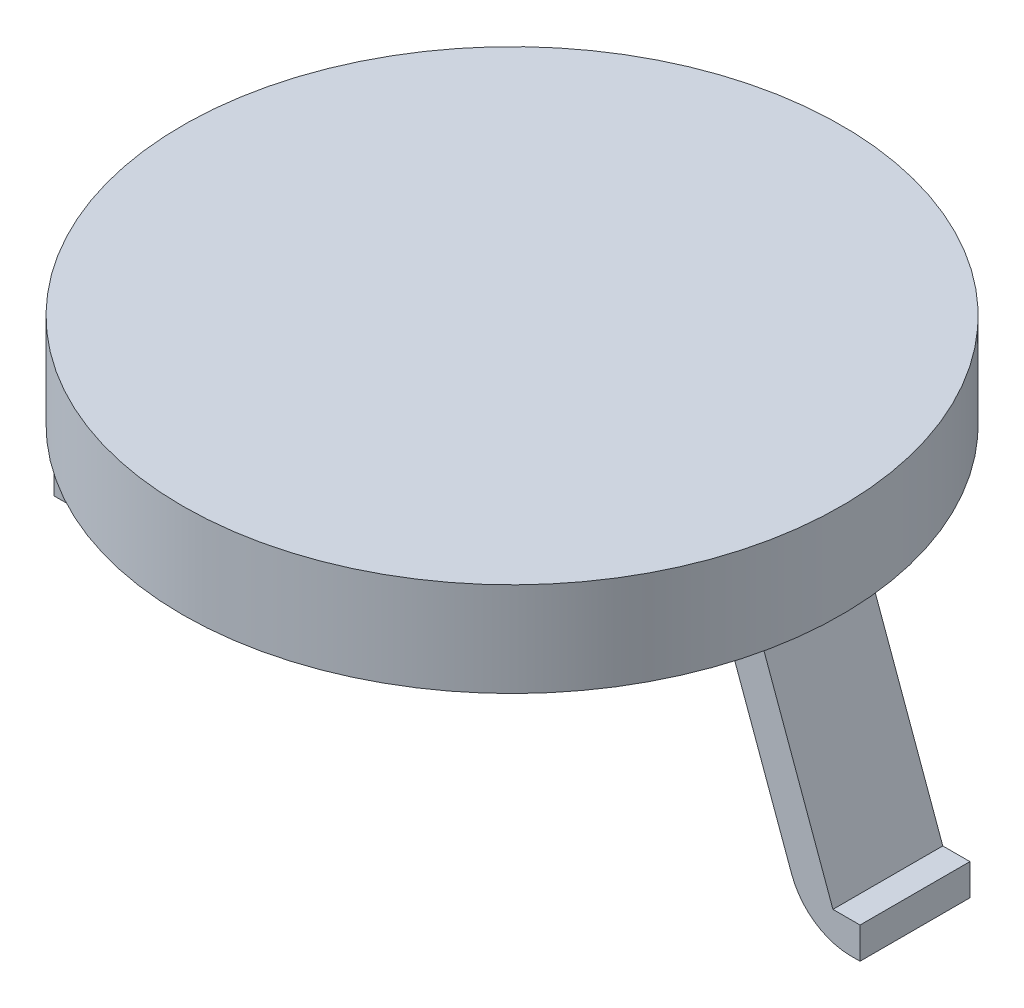
ISO-10303-21;
HEADER;
FILE_DESCRIPTION(('STEP AP214'),'2;1');
FILE_NAME('part.step','',(''),(''),'','','');
FILE_SCHEMA(('AUTOMOTIVE_DESIGN { 1 0 10303 214 1 1 1 1 }'));
ENDSEC;
DATA;
#1=APPLICATION_CONTEXT('core data for automotive mechanical design processes');
#2=APPLICATION_PROTOCOL_DEFINITION('international standard','automotive_design',2000,#1);
#3=PRODUCT_CONTEXT('',#1,'mechanical');
#4=PRODUCT('Part','Part','',(#3));
#5=PRODUCT_RELATED_PRODUCT_CATEGORY('part','',(#4));
#6=PRODUCT_DEFINITION_FORMATION('','',#4);
#7=PRODUCT_DEFINITION_CONTEXT('part definition',#1,'design');
#8=PRODUCT_DEFINITION('design','',#6,#7);
#9=PRODUCT_DEFINITION_SHAPE('','',#8);
#10=(LENGTH_UNIT() NAMED_UNIT(*) SI_UNIT(.MILLI.,.METRE.));
#11=(NAMED_UNIT(*) PLANE_ANGLE_UNIT() SI_UNIT($,.RADIAN.));
#12=(NAMED_UNIT(*) SI_UNIT($,.STERADIAN.) SOLID_ANGLE_UNIT());
#13=UNCERTAINTY_MEASURE_WITH_UNIT(LENGTH_MEASURE(1.E-05),#10,'distance_accuracy_value','');
#14=(GEOMETRIC_REPRESENTATION_CONTEXT(3) GLOBAL_UNCERTAINTY_ASSIGNED_CONTEXT((#13)) GLOBAL_UNIT_ASSIGNED_CONTEXT((#10,
#11,#12)) REPRESENTATION_CONTEXT('',''));
#15=CARTESIAN_POINT('',(0.,0.,0.));
#16=DIRECTION('',(0.,0.,1.));
#17=DIRECTION('',(1.,0.,0.));
#18=AXIS2_PLACEMENT_3D('',#15,#16,#17);
#19=CARTESIAN_POINT('',(0.,3.,0.));
#20=DIRECTION('',(0.,-1.,0.));
#21=DIRECTION('',(0.,0.,-1.));
#22=AXIS2_PLACEMENT_3D('',#19,#20,#21);
#23=CYLINDRICAL_SURFACE('',#22,10.5);
#24=CARTESIAN_POINT('',(0.,3.,0.));
#25=DIRECTION('',(0.,1.,0.));
#26=DIRECTION('',(0.,0.,1.));
#27=AXIS2_PLACEMENT_3D('',#24,#25,#26);
#28=CIRCLE('',#27,10.5);
#29=CARTESIAN_POINT('',(0.,3.,10.5));
#30=VERTEX_POINT('',#29);
#31=EDGE_CURVE('E269',#30,#30,#28,.T.);
#32=ORIENTED_EDGE('',*,*,#31,.F.);
#33=EDGE_LOOP('',(#32));
#34=FACE_BOUND('',#33,.T.);
#35=CARTESIAN_POINT('',(0.,0.,0.));
#36=DIRECTION('',(0.,1.,0.));
#37=DIRECTION('',(0.,0.,1.));
#38=AXIS2_PLACEMENT_3D('',#35,#36,#37);
#39=CIRCLE('',#38,10.5);
#40=CARTESIAN_POINT('',(0.,0.,10.5));
#41=VERTEX_POINT('',#40);
#42=EDGE_CURVE('E266',#41,#41,#39,.T.);
#43=ORIENTED_EDGE('',*,*,#42,.T.);
#44=EDGE_LOOP('',(#43));
#45=FACE_BOUND('',#44,.T.);
#46=ADVANCED_FACE('F39',(#34,#45),#23,.T.);
#47=CARTESIAN_POINT('',(0.,3.,0.));
#48=DIRECTION('',(0.,1.,0.));
#49=DIRECTION('',(0.,0.,1.));
#50=AXIS2_PLACEMENT_3D('',#47,#48,#49);
#51=PLANE('',#50);
#52=ORIENTED_EDGE('',*,*,#31,.T.);
#53=EDGE_LOOP('',(#52));
#54=FACE_BOUND('',#53,.T.);
#55=ADVANCED_FACE('F335',(#54),#51,.T.);
#56=CARTESIAN_POINT('',(0.,0.,0.));
#57=DIRECTION('',(0.,1.,0.));
#58=DIRECTION('',(0.,0.,1.));
#59=AXIS2_PLACEMENT_3D('',#56,#57,#58);
#60=PLANE('',#59);
#61=DIRECTION('',(0.,0.,1.));
#62=VECTOR('',#61,1.);
#63=CARTESIAN_POINT('',(8.4,0.,-1.75));
#64=LINE('',#63,#62);
#65=CARTESIAN_POINT('',(8.4,0.,1.75));
#66=VERTEX_POINT('',#65);
#67=CARTESIAN_POINT('',(8.4,0.,-1.75));
#68=VERTEX_POINT('',#67);
#69=EDGE_CURVE('E205',#66,#68,#64,.F.);
#70=ORIENTED_EDGE('',*,*,#69,.F.);
#71=DIRECTION('',(-1.,0.,0.));
#72=VECTOR('',#71,1.);
#73=CARTESIAN_POINT('',(9.6,0.,1.75));
#74=LINE('',#73,#72);
#75=CARTESIAN_POINT('',(9.6,0.,1.75));
#76=VERTEX_POINT('',#75);
#77=EDGE_CURVE('E199',#76,#66,#74,.T.);
#78=ORIENTED_EDGE('',*,*,#77,.F.);
#79=DIRECTION('',(0.,0.,1.));
#80=VECTOR('',#79,1.);
#81=CARTESIAN_POINT('',(9.6,0.,-1.75));
#82=LINE('',#81,#80);
#83=CARTESIAN_POINT('',(9.6,0.,-1.75));
#84=VERTEX_POINT('',#83);
#85=EDGE_CURVE('E218',#84,#76,#82,.T.);
#86=ORIENTED_EDGE('',*,*,#85,.F.);
#87=DIRECTION('',(-1.,0.,0.));
#88=VECTOR('',#87,1.);
#89=CARTESIAN_POINT('',(9.6,0.,-1.75));
#90=LINE('',#89,#88);
#91=EDGE_CURVE('E221',#68,#84,#90,.F.);
#92=ORIENTED_EDGE('',*,*,#91,.F.);
#93=EDGE_LOOP('',(#70,#78,#86,#92));
#94=FACE_BOUND('',#93,.T.);
#95=DIRECTION('',(0.,0.,1.));
#96=VECTOR('',#95,1.);
#97=CARTESIAN_POINT('',(-8.4,0.,-1.75));
#98=LINE('',#97,#96);
#99=CARTESIAN_POINT('',(-8.4,0.,-1.75));
#100=VERTEX_POINT('',#99);
#101=CARTESIAN_POINT('',(-8.4,0.,1.75));
#102=VERTEX_POINT('',#101);
#103=EDGE_CURVE('E239',#100,#102,#98,.T.);
#104=ORIENTED_EDGE('',*,*,#103,.F.);
#105=DIRECTION('',(1.,0.,0.));
#106=VECTOR('',#105,1.);
#107=CARTESIAN_POINT('',(-9.6,0.,-1.75));
#108=LINE('',#107,#106);
#109=CARTESIAN_POINT('',(-9.6,0.,-1.75));
#110=VERTEX_POINT('',#109);
#111=EDGE_CURVE('E234',#110,#100,#108,.T.);
#112=ORIENTED_EDGE('',*,*,#111,.F.);
#113=DIRECTION('',(0.,0.,1.));
#114=VECTOR('',#113,1.);
#115=CARTESIAN_POINT('',(-9.6,0.,-1.75));
#116=LINE('',#115,#114);
#117=CARTESIAN_POINT('',(-9.6,0.,1.75));
#118=VERTEX_POINT('',#117);
#119=EDGE_CURVE('E249',#118,#110,#116,.F.);
#120=ORIENTED_EDGE('',*,*,#119,.F.);
#121=DIRECTION('',(1.,0.,0.));
#122=VECTOR('',#121,1.);
#123=CARTESIAN_POINT('',(-9.6,0.,1.75));
#124=LINE('',#123,#122);
#125=EDGE_CURVE('E252',#102,#118,#124,.F.);
#126=ORIENTED_EDGE('',*,*,#125,.F.);
#127=EDGE_LOOP('',(#104,#112,#120,#126));
#128=FACE_BOUND('',#127,.T.);
#129=ORIENTED_EDGE('',*,*,#42,.F.);
#130=EDGE_LOOP('',(#129));
#131=FACE_BOUND('',#130,.T.);
#132=ADVANCED_FACE('F325',(#94,#128,#131),#60,.F.);
#133=CARTESIAN_POINT('',(-2.73616114660536,-7.51754096628726,0.));
#134=DIRECTION('',(0.,-1.,0.));
#135=DIRECTION('',(0.,0.,-1.));
#136=AXIS2_PLACEMENT_3D('',#133,#134,#135);
#137=PLANE('',#136);
#138=DIRECTION('',(1.,0.,0.));
#139=VECTOR('',#138,1.);
#140=CARTESIAN_POINT('',(-12.3361611466054,-7.51754096628726,-1.75));
#141=LINE('',#140,#139);
#142=CARTESIAN_POINT('',(-12.8361611466054,-7.51754096628726,-1.75));
#143=VERTEX_POINT('',#142);
#144=CARTESIAN_POINT('',(-12.5365762230248,-7.51754096628726,-1.75));
#145=VERTEX_POINT('',#144);
#146=EDGE_CURVE('E160',#143,#145,#141,.T.);
#147=ORIENTED_EDGE('',*,*,#146,.T.);
#148=DIRECTION('',(0.,0.,1.));
#149=VECTOR('',#148,1.);
#150=CARTESIAN_POINT('',(-12.5365762230248,-7.51754096628726,0.));
#151=LINE('',#150,#149);
#152=CARTESIAN_POINT('',(-12.5365762230248,-7.51754096628726,1.75));
#153=VERTEX_POINT('',#152);
#154=EDGE_CURVE('E281',#145,#153,#151,.T.);
#155=ORIENTED_EDGE('',*,*,#154,.T.);
#156=DIRECTION('',(1.,0.,0.));
#157=VECTOR('',#156,1.);
#158=CARTESIAN_POINT('',(-12.3361611466054,-7.51754096628726,1.75));
#159=LINE('',#158,#157);
#160=CARTESIAN_POINT('',(-12.8361611466054,-7.51754096628726,1.75));
#161=VERTEX_POINT('',#160);
#162=EDGE_CURVE('E256',#153,#161,#159,.F.);
#163=ORIENTED_EDGE('',*,*,#162,.T.);
#164=DIRECTION('',(0.,0.,1.));
#165=VECTOR('',#164,1.);
#166=CARTESIAN_POINT('',(-12.8361611466054,-7.51754096628726,-1.75));
#167=LINE('',#166,#165);
#168=EDGE_CURVE('E170',#143,#161,#167,.T.);
#169=ORIENTED_EDGE('',*,*,#168,.F.);
#170=EDGE_LOOP('',(#147,#155,#163,#169));
#171=FACE_BOUND('',#170,.T.);
#172=ADVANCED_FACE('F347',(#171),#137,.T.);
#173=CARTESIAN_POINT('',(-9.6,0.,-1.75));
#174=DIRECTION('',(0.,0.,-1.));
#175=DIRECTION('',(-1.,0.,0.));
#176=AXIS2_PLACEMENT_3D('',#173,#174,#175);
#177=PLANE('',#176);
#178=DIRECTION('',(-0.342020143325669,-0.939692620785908,0.));
#179=VECTOR('',#178,1.);
#180=CARTESIAN_POINT('',(-8.4,0.,-1.75));
#181=LINE('',#180,#179);
#182=CARTESIAN_POINT('',(-10.657190981453,-6.2015812529386,-1.75));
#183=VERTEX_POINT('',#182);
#184=EDGE_CURVE('E242',#100,#183,#181,.T.);
#185=ORIENTED_EDGE('',*,*,#184,.T.);
#186=CARTESIAN_POINT('',(-12.5365762230248,-5.51754096628726,-1.75));
#187=DIRECTION('',(0.,0.,-1.));
#188=DIRECTION('',(-1.,0.,0.));
#189=AXIS2_PLACEMENT_3D('',#186,#187,#188);
#190=CIRCLE('',#189,2.);
#191=EDGE_CURVE('E291',#183,#145,#190,.T.);
#192=ORIENTED_EDGE('',*,*,#191,.T.);
#193=ORIENTED_EDGE('',*,*,#146,.F.);
#194=DIRECTION('',(0.,-1.,0.));
#195=VECTOR('',#194,1.);
#196=CARTESIAN_POINT('',(-12.8361611466054,-6.51754096628726,-1.75));
#197=LINE('',#196,#195);
#198=CARTESIAN_POINT('',(-12.8361611466054,-6.51754096628726,-1.75));
#199=VERTEX_POINT('',#198);
#200=EDGE_CURVE('E156',#199,#143,#197,.T.);
#201=ORIENTED_EDGE('',*,*,#200,.F.);
#202=DIRECTION('',(-1.,0.,0.));
#203=VECTOR('',#202,1.);
#204=CARTESIAN_POINT('',(-11.8361611466054,-6.51754096628726,-1.75));
#205=LINE('',#204,#203);
#206=CARTESIAN_POINT('',(-11.9721909123392,-6.51754096628726,-1.75));
#207=VERTEX_POINT('',#206);
#208=EDGE_CURVE('E141',#207,#199,#205,.T.);
#209=ORIENTED_EDGE('',*,*,#208,.F.);
#210=DIRECTION('',(-0.342020143325669,-0.939692620785908,0.));
#211=VECTOR('',#210,1.);
#212=CARTESIAN_POINT('',(-9.6,0.,-1.75));
#213=LINE('',#212,#211);
#214=EDGE_CURVE('E243',#110,#207,#213,.T.);
#215=ORIENTED_EDGE('',*,*,#214,.F.);
#216=ORIENTED_EDGE('',*,*,#111,.T.);
#217=EDGE_LOOP('',(#185,#192,#193,#201,#209,#215,#216));
#218=FACE_BOUND('',#217,.T.);
#219=ADVANCED_FACE('F158',(#218),#177,.T.);
#220=CARTESIAN_POINT('',(-8.4,0.,-1.75));
#221=DIRECTION('',(0.939692620785908,-0.342020143325669,0.));
#222=DIRECTION('',(0.342020143325669,0.939692620785908,0.));
#223=AXIS2_PLACEMENT_3D('',#220,#221,#222);
#224=PLANE('',#223);
#225=DIRECTION('',(-0.342020143325669,-0.939692620785908,0.));
#226=VECTOR('',#225,1.);
#227=CARTESIAN_POINT('',(-8.4,0.,1.75));
#228=LINE('',#227,#226);
#229=CARTESIAN_POINT('',(-10.657190981453,-6.2015812529386,1.75));
#230=VERTEX_POINT('',#229);
#231=EDGE_CURVE('E246',#102,#230,#228,.T.);
#232=ORIENTED_EDGE('',*,*,#231,.T.);
#233=DIRECTION('',(0.,0.,1.));
#234=VECTOR('',#233,1.);
#235=CARTESIAN_POINT('',(-10.657190981453,-6.2015812529386,-1.75));
#236=LINE('',#235,#234);
#237=EDGE_CURVE('E288',#230,#183,#236,.F.);
#238=ORIENTED_EDGE('',*,*,#237,.T.);
#239=ORIENTED_EDGE('',*,*,#184,.F.);
#240=ORIENTED_EDGE('',*,*,#103,.T.);
#241=EDGE_LOOP('',(#232,#238,#239,#240));
#242=FACE_BOUND('',#241,.T.);
#243=ADVANCED_FACE('F359',(#242),#224,.T.);
#244=CARTESIAN_POINT('',(-9.6,0.,1.75));
#245=DIRECTION('',(0.,0.,1.));
#246=DIRECTION('',(1.,0.,0.));
#247=AXIS2_PLACEMENT_3D('',#244,#245,#246);
#248=PLANE('',#247);
#249=ORIENTED_EDGE('',*,*,#162,.F.);
#250=CARTESIAN_POINT('',(-12.5365762230248,-5.51754096628726,1.75));
#251=DIRECTION('',(0.,0.,1.));
#252=DIRECTION('',(1.,0.,0.));
#253=AXIS2_PLACEMENT_3D('',#250,#251,#252);
#254=CIRCLE('',#253,2.);
#255=EDGE_CURVE('E285',#153,#230,#254,.T.);
#256=ORIENTED_EDGE('',*,*,#255,.T.);
#257=ORIENTED_EDGE('',*,*,#231,.F.);
#258=ORIENTED_EDGE('',*,*,#125,.T.);
#259=DIRECTION('',(-0.342020143325669,-0.939692620785908,0.));
#260=VECTOR('',#259,1.);
#261=CARTESIAN_POINT('',(-9.6,0.,1.75));
#262=LINE('',#261,#260);
#263=CARTESIAN_POINT('',(-11.9721909123392,-6.51754096628726,1.75));
#264=VERTEX_POINT('',#263);
#265=EDGE_CURVE('E262',#118,#264,#262,.T.);
#266=ORIENTED_EDGE('',*,*,#265,.T.);
#267=DIRECTION('',(1.,0.,0.));
#268=VECTOR('',#267,1.);
#269=CARTESIAN_POINT('',(-11.8361611466054,-6.51754096628726,1.75));
#270=LINE('',#269,#268);
#271=CARTESIAN_POINT('',(-12.8361611466054,-6.51754096628726,1.75));
#272=VERTEX_POINT('',#271);
#273=EDGE_CURVE('E153',#272,#264,#270,.T.);
#274=ORIENTED_EDGE('',*,*,#273,.F.);
#275=DIRECTION('',(0.,-1.,0.));
#276=VECTOR('',#275,1.);
#277=CARTESIAN_POINT('',(-12.8361611466054,-6.51754096628726,1.75));
#278=LINE('',#277,#276);
#279=EDGE_CURVE('E165',#272,#161,#278,.T.);
#280=ORIENTED_EDGE('',*,*,#279,.T.);
#281=EDGE_LOOP('',(#249,#256,#257,#258,#266,#274,#280));
#282=FACE_BOUND('',#281,.T.);
#283=ADVANCED_FACE('F355',(#282),#248,.T.);
#284=CARTESIAN_POINT('',(-9.6,0.,-1.75));
#285=DIRECTION('',(-0.939692620785908,0.342020143325669,0.));
#286=DIRECTION('',(-0.342020143325669,-0.939692620785908,0.));
#287=AXIS2_PLACEMENT_3D('',#284,#285,#286);
#288=PLANE('',#287);
#289=DIRECTION('',(0.,0.,-1.));
#290=VECTOR('',#289,1.);
#291=CARTESIAN_POINT('',(-11.9721909123392,-6.51754096628726,-1.75));
#292=LINE('',#291,#290);
#293=EDGE_CURVE('E148',#264,#207,#292,.T.);
#294=ORIENTED_EDGE('',*,*,#293,.F.);
#295=ORIENTED_EDGE('',*,*,#265,.F.);
#296=ORIENTED_EDGE('',*,*,#119,.T.);
#297=ORIENTED_EDGE('',*,*,#214,.T.);
#298=EDGE_LOOP('',(#294,#295,#296,#297));
#299=FACE_BOUND('',#298,.T.);
#300=ADVANCED_FACE('F348',(#299),#288,.T.);
#301=CARTESIAN_POINT('',(2.73616114660536,-7.51754096628726,0.));
#302=DIRECTION('',(0.,-1.,0.));
#303=DIRECTION('',(0.,0.,-1.));
#304=AXIS2_PLACEMENT_3D('',#301,#302,#303);
#305=PLANE('',#304);
#306=DIRECTION('',(-1.,0.,0.));
#307=VECTOR('',#306,1.);
#308=CARTESIAN_POINT('',(12.3361611466054,-7.51754096628726,1.75));
#309=LINE('',#308,#307);
#310=CARTESIAN_POINT('',(12.8361611466054,-7.51754096628726,1.75));
#311=VERTEX_POINT('',#310);
#312=CARTESIAN_POINT('',(12.5365762230248,-7.51754096628726,1.75));
#313=VERTEX_POINT('',#312);
#314=EDGE_CURVE('E206',#311,#313,#309,.T.);
#315=ORIENTED_EDGE('',*,*,#314,.T.);
#316=DIRECTION('',(0.,0.,-1.));
#317=VECTOR('',#316,1.);
#318=CARTESIAN_POINT('',(12.5365762230248,-7.51754096628726,0.));
#319=LINE('',#318,#317);
#320=CARTESIAN_POINT('',(12.5365762230248,-7.51754096628726,-1.75));
#321=VERTEX_POINT('',#320);
#322=EDGE_CURVE('E294',#313,#321,#319,.T.);
#323=ORIENTED_EDGE('',*,*,#322,.T.);
#324=DIRECTION('',(-1.,0.,0.));
#325=VECTOR('',#324,1.);
#326=CARTESIAN_POINT('',(12.3361611466054,-7.51754096628726,-1.75));
#327=LINE('',#326,#325);
#328=CARTESIAN_POINT('',(12.8361611466054,-7.51754096628726,-1.75));
#329=VERTEX_POINT('',#328);
#330=EDGE_CURVE('E224',#321,#329,#327,.F.);
#331=ORIENTED_EDGE('',*,*,#330,.T.);
#332=DIRECTION('',(0.,0.,1.));
#333=VECTOR('',#332,1.);
#334=CARTESIAN_POINT('',(12.8361611466054,-7.51754096628726,-1.75));
#335=LINE('',#334,#333);
#336=EDGE_CURVE('E178',#329,#311,#335,.T.);
#337=ORIENTED_EDGE('',*,*,#336,.T.);
#338=EDGE_LOOP('',(#315,#323,#331,#337));
#339=FACE_BOUND('',#338,.T.);
#340=ADVANCED_FACE('F302',(#339),#305,.T.);
#341=CARTESIAN_POINT('',(9.6,0.,1.75));
#342=DIRECTION('',(0.,0.,1.));
#343=DIRECTION('',(1.,0.,0.));
#344=AXIS2_PLACEMENT_3D('',#341,#342,#343);
#345=PLANE('',#344);
#346=DIRECTION('',(0.342020143325669,-0.939692620785908,0.));
#347=VECTOR('',#346,1.);
#348=CARTESIAN_POINT('',(8.4,0.,1.75));
#349=LINE('',#348,#347);
#350=CARTESIAN_POINT('',(10.657190981453,-6.2015812529386,1.75));
#351=VERTEX_POINT('',#350);
#352=EDGE_CURVE('E210',#66,#351,#349,.T.);
#353=ORIENTED_EDGE('',*,*,#352,.T.);
#354=CARTESIAN_POINT('',(12.5365762230248,-5.51754096628726,1.75));
#355=DIRECTION('',(0.,0.,1.));
#356=DIRECTION('',(1.,0.,0.));
#357=AXIS2_PLACEMENT_3D('',#354,#355,#356);
#358=CIRCLE('',#357,2.);
#359=EDGE_CURVE('E11',#351,#313,#358,.T.);
#360=ORIENTED_EDGE('',*,*,#359,.T.);
#361=ORIENTED_EDGE('',*,*,#314,.F.);
#362=DIRECTION('',(0.,-1.,0.));
#363=VECTOR('',#362,1.);
#364=CARTESIAN_POINT('',(12.8361611466054,-6.51754096628726,1.75));
#365=LINE('',#364,#363);
#366=CARTESIAN_POINT('',(12.8361611466054,-6.51754096628726,1.75));
#367=VERTEX_POINT('',#366);
#368=EDGE_CURVE('E191',#367,#311,#365,.T.);
#369=ORIENTED_EDGE('',*,*,#368,.F.);
#370=DIRECTION('',(-1.,0.,0.));
#371=VECTOR('',#370,1.);
#372=CARTESIAN_POINT('',(11.8361611466054,-6.51754096628726,1.75));
#373=LINE('',#372,#371);
#374=CARTESIAN_POINT('',(11.9721909123392,-6.51754096628726,1.75));
#375=VERTEX_POINT('',#374);
#376=EDGE_CURVE('E184',#367,#375,#373,.T.);
#377=ORIENTED_EDGE('',*,*,#376,.T.);
#378=DIRECTION('',(0.342020143325669,-0.939692620785908,0.));
#379=VECTOR('',#378,1.);
#380=CARTESIAN_POINT('',(9.6,0.,1.75));
#381=LINE('',#380,#379);
#382=EDGE_CURVE('E211',#76,#375,#381,.T.);
#383=ORIENTED_EDGE('',*,*,#382,.F.);
#384=ORIENTED_EDGE('',*,*,#77,.T.);
#385=EDGE_LOOP('',(#353,#360,#361,#369,#377,#383,#384));
#386=FACE_BOUND('',#385,.T.);
#387=ADVANCED_FACE('F313',(#386),#345,.T.);
#388=CARTESIAN_POINT('',(8.4,0.,-1.75));
#389=DIRECTION('',(-0.939692620785908,-0.342020143325669,0.));
#390=DIRECTION('',(0.342020143325669,-0.939692620785908,0.));
#391=AXIS2_PLACEMENT_3D('',#388,#389,#390);
#392=PLANE('',#391);
#393=DIRECTION('',(0.342020143325669,-0.939692620785908,0.));
#394=VECTOR('',#393,1.);
#395=CARTESIAN_POINT('',(8.4,0.,-1.75));
#396=LINE('',#395,#394);
#397=CARTESIAN_POINT('',(10.657190981453,-6.2015812529386,-1.75));
#398=VERTEX_POINT('',#397);
#399=EDGE_CURVE('E214',#68,#398,#396,.T.);
#400=ORIENTED_EDGE('',*,*,#399,.T.);
#401=DIRECTION('',(0.,0.,-1.));
#402=VECTOR('',#401,1.);
#403=CARTESIAN_POINT('',(10.657190981453,-6.2015812529386,-1.75));
#404=LINE('',#403,#402);
#405=EDGE_CURVE('E48',#398,#351,#404,.F.);
#406=ORIENTED_EDGE('',*,*,#405,.T.);
#407=ORIENTED_EDGE('',*,*,#352,.F.);
#408=ORIENTED_EDGE('',*,*,#69,.T.);
#409=EDGE_LOOP('',(#400,#406,#407,#408));
#410=FACE_BOUND('',#409,.T.);
#411=ADVANCED_FACE('F327',(#410),#392,.T.);
#412=CARTESIAN_POINT('',(9.6,0.,-1.75));
#413=DIRECTION('',(0.,0.,-1.));
#414=DIRECTION('',(-1.,0.,0.));
#415=AXIS2_PLACEMENT_3D('',#412,#413,#414);
#416=PLANE('',#415);
#417=ORIENTED_EDGE('',*,*,#330,.F.);
#418=CARTESIAN_POINT('',(12.5365762230248,-5.51754096628726,-1.75));
#419=DIRECTION('',(0.,0.,-1.));
#420=DIRECTION('',(-1.,0.,0.));
#421=AXIS2_PLACEMENT_3D('',#418,#419,#420);
#422=CIRCLE('',#421,2.);
#423=EDGE_CURVE('E62',#321,#398,#422,.T.);
#424=ORIENTED_EDGE('',*,*,#423,.T.);
#425=ORIENTED_EDGE('',*,*,#399,.F.);
#426=ORIENTED_EDGE('',*,*,#91,.T.);
#427=DIRECTION('',(0.342020143325669,-0.939692620785908,0.));
#428=VECTOR('',#427,1.);
#429=CARTESIAN_POINT('',(9.6,0.,-1.75));
#430=LINE('',#429,#428);
#431=CARTESIAN_POINT('',(11.9721909123392,-6.51754096628726,-1.75));
#432=VERTEX_POINT('',#431);
#433=EDGE_CURVE('E230',#84,#432,#430,.T.);
#434=ORIENTED_EDGE('',*,*,#433,.T.);
#435=DIRECTION('',(1.,0.,0.));
#436=VECTOR('',#435,1.);
#437=CARTESIAN_POINT('',(11.8361611466054,-6.51754096628726,-1.75));
#438=LINE('',#437,#436);
#439=CARTESIAN_POINT('',(12.8361611466054,-6.51754096628726,-1.75));
#440=VERTEX_POINT('',#439);
#441=EDGE_CURVE('E188',#432,#440,#438,.T.);
#442=ORIENTED_EDGE('',*,*,#441,.T.);
#443=DIRECTION('',(0.,-1.,0.));
#444=VECTOR('',#443,1.);
#445=CARTESIAN_POINT('',(12.8361611466054,-6.51754096628726,-1.75));
#446=LINE('',#445,#444);
#447=EDGE_CURVE('E195',#440,#329,#446,.T.);
#448=ORIENTED_EDGE('',*,*,#447,.T.);
#449=EDGE_LOOP('',(#417,#424,#425,#426,#434,#442,#448));
#450=FACE_BOUND('',#449,.T.);
#451=ADVANCED_FACE('F305',(#450),#416,.T.);
#452=CARTESIAN_POINT('',(9.6,0.,-1.75));
#453=DIRECTION('',(0.939692620785908,0.342020143325669,0.));
#454=DIRECTION('',(-0.342020143325669,0.939692620785908,0.));
#455=AXIS2_PLACEMENT_3D('',#452,#453,#454);
#456=PLANE('',#455);
#457=DIRECTION('',(0.,0.,1.));
#458=VECTOR('',#457,1.);
#459=CARTESIAN_POINT('',(11.9721909123392,-6.51754096628726,-1.75));
#460=LINE('',#459,#458);
#461=EDGE_CURVE('E273',#432,#375,#460,.T.);
#462=ORIENTED_EDGE('',*,*,#461,.F.);
#463=ORIENTED_EDGE('',*,*,#433,.F.);
#464=ORIENTED_EDGE('',*,*,#85,.T.);
#465=ORIENTED_EDGE('',*,*,#382,.T.);
#466=EDGE_LOOP('',(#462,#463,#464,#465));
#467=FACE_BOUND('',#466,.T.);
#468=ADVANCED_FACE('F319',(#467),#456,.T.);
#469=CARTESIAN_POINT('',(12.8361611466054,-6.51754096628726,-1.75));
#470=DIRECTION('',(1.,0.,0.));
#471=DIRECTION('',(0.,0.,-1.));
#472=AXIS2_PLACEMENT_3D('',#469,#470,#471);
#473=PLANE('',#472);
#474=ORIENTED_EDGE('',*,*,#336,.F.);
#475=ORIENTED_EDGE('',*,*,#447,.F.);
#476=DIRECTION('',(0.,0.,1.));
#477=VECTOR('',#476,1.);
#478=CARTESIAN_POINT('',(12.8361611466054,-6.51754096628726,-1.75));
#479=LINE('',#478,#477);
#480=EDGE_CURVE('E180',#440,#367,#479,.T.);
#481=ORIENTED_EDGE('',*,*,#480,.T.);
#482=ORIENTED_EDGE('',*,*,#368,.T.);
#483=EDGE_LOOP('',(#474,#475,#481,#482));
#484=FACE_BOUND('',#483,.T.);
#485=ADVANCED_FACE('F310',(#484),#473,.T.);
#486=CARTESIAN_POINT('',(0.,-6.51754096628726,0.));
#487=DIRECTION('',(0.,1.,0.));
#488=DIRECTION('',(0.,0.,1.));
#489=AXIS2_PLACEMENT_3D('',#486,#487,#488);
#490=PLANE('',#489);
#491=ORIENTED_EDGE('',*,*,#441,.F.);
#492=ORIENTED_EDGE('',*,*,#461,.T.);
#493=ORIENTED_EDGE('',*,*,#376,.F.);
#494=ORIENTED_EDGE('',*,*,#480,.F.);
#495=EDGE_LOOP('',(#491,#492,#493,#494));
#496=FACE_BOUND('',#495,.T.);
#497=ADVANCED_FACE('F316',(#496),#490,.T.);
#498=CARTESIAN_POINT('',(-12.8361611466054,-6.51754096628726,-1.75));
#499=DIRECTION('',(1.,0.,0.));
#500=DIRECTION('',(0.,0.,-1.));
#501=AXIS2_PLACEMENT_3D('',#498,#499,#500);
#502=PLANE('',#501);
#503=ORIENTED_EDGE('',*,*,#168,.T.);
#504=ORIENTED_EDGE('',*,*,#279,.F.);
#505=DIRECTION('',(0.,0.,1.));
#506=VECTOR('',#505,1.);
#507=CARTESIAN_POINT('',(-12.8361611466054,-6.51754096628726,-1.75));
#508=LINE('',#507,#506);
#509=EDGE_CURVE('E145',#199,#272,#508,.T.);
#510=ORIENTED_EDGE('',*,*,#509,.F.);
#511=ORIENTED_EDGE('',*,*,#200,.T.);
#512=EDGE_LOOP('',(#503,#504,#510,#511));
#513=FACE_BOUND('',#512,.T.);
#514=ADVANCED_FACE('F167',(#513),#502,.F.);
#515=CARTESIAN_POINT('',(0.,-6.51754096628726,0.));
#516=DIRECTION('',(0.,1.,0.));
#517=DIRECTION('',(0.,0.,1.));
#518=AXIS2_PLACEMENT_3D('',#515,#516,#517);
#519=PLANE('',#518);
#520=ORIENTED_EDGE('',*,*,#273,.T.);
#521=ORIENTED_EDGE('',*,*,#293,.T.);
#522=ORIENTED_EDGE('',*,*,#208,.T.);
#523=ORIENTED_EDGE('',*,*,#509,.T.);
#524=EDGE_LOOP('',(#520,#521,#522,#523));
#525=FACE_BOUND('',#524,.T.);
#526=ADVANCED_FACE('F143',(#525),#519,.T.);
#527=CARTESIAN_POINT('',(-12.5365762230248,-5.51754096628726,0.));
#528=DIRECTION('',(0.,0.,1.));
#529=DIRECTION('',(1.,0.,0.));
#530=AXIS2_PLACEMENT_3D('',#527,#528,#529);
#531=CYLINDRICAL_SURFACE('',#530,2.);
#532=ORIENTED_EDGE('',*,*,#191,.F.);
#533=ORIENTED_EDGE('',*,*,#237,.F.);
#534=ORIENTED_EDGE('',*,*,#255,.F.);
#535=ORIENTED_EDGE('',*,*,#154,.F.);
#536=EDGE_LOOP('',(#532,#533,#534,#535));
#537=FACE_BOUND('',#536,.T.);
#538=ADVANCED_FACE('F329',(#537),#531,.T.);
#539=CARTESIAN_POINT('',(12.5365762230248,-5.51754096628726,0.));
#540=DIRECTION('',(0.,0.,-1.));
#541=DIRECTION('',(-1.,0.,0.));
#542=AXIS2_PLACEMENT_3D('',#539,#540,#541);
#543=CYLINDRICAL_SURFACE('',#542,2.);
#544=ORIENTED_EDGE('',*,*,#359,.F.);
#545=ORIENTED_EDGE('',*,*,#405,.F.);
#546=ORIENTED_EDGE('',*,*,#423,.F.);
#547=ORIENTED_EDGE('',*,*,#322,.F.);
#548=EDGE_LOOP('',(#544,#545,#546,#547));
#549=FACE_BOUND('',#548,.T.);
#550=ADVANCED_FACE('F41',(#549),#543,.T.);
#551=CLOSED_SHELL('',(#46,#55,#132,#172,#219,#243,#283,#300,#340,#387,#411,#451,#468,#485,#497,
#514,#526,#538,#550));
#552=MANIFOLD_SOLID_BREP('B2',#551);
#553=ADVANCED_BREP_SHAPE_REPRESENTATION('',(#18,#552),#14);
#554=SHAPE_DEFINITION_REPRESENTATION(#9,#553);
ENDSEC;
END-ISO-10303-21;
